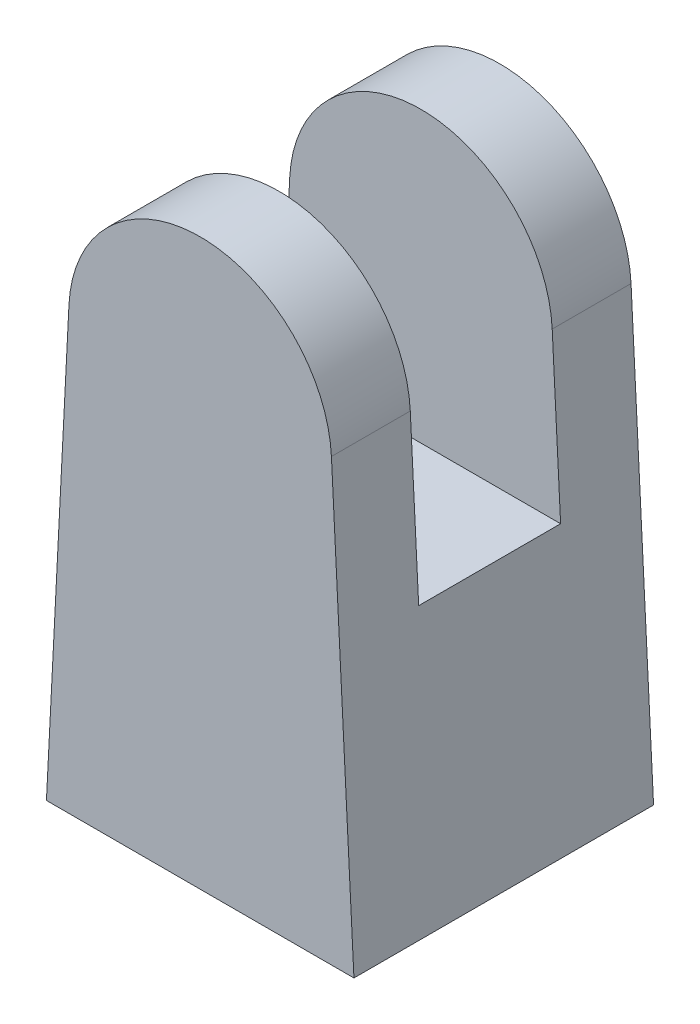
ISO-10303-21;
HEADER;
FILE_DESCRIPTION(('STEP AP214'),'2;1');
FILE_NAME('part.step','',(''),(''),'','','');
FILE_SCHEMA(('AUTOMOTIVE_DESIGN { 1 0 10303 214 1 1 1 1 }'));
ENDSEC;
DATA;
#1=APPLICATION_CONTEXT('core data for automotive mechanical design processes');
#2=APPLICATION_PROTOCOL_DEFINITION('international standard','automotive_design',2000,#1);
#3=PRODUCT_CONTEXT('',#1,'mechanical');
#4=PRODUCT('Part','Part','',(#3));
#5=PRODUCT_RELATED_PRODUCT_CATEGORY('part','',(#4));
#6=PRODUCT_DEFINITION_FORMATION('','',#4);
#7=PRODUCT_DEFINITION_CONTEXT('part definition',#1,'design');
#8=PRODUCT_DEFINITION('design','',#6,#7);
#9=PRODUCT_DEFINITION_SHAPE('','',#8);
#10=(LENGTH_UNIT() NAMED_UNIT(*) SI_UNIT(.MILLI.,.METRE.));
#11=(NAMED_UNIT(*) PLANE_ANGLE_UNIT() SI_UNIT($,.RADIAN.));
#12=(NAMED_UNIT(*) SI_UNIT($,.STERADIAN.) SOLID_ANGLE_UNIT());
#13=UNCERTAINTY_MEASURE_WITH_UNIT(LENGTH_MEASURE(1.E-05),#10,'distance_accuracy_value','');
#14=(GEOMETRIC_REPRESENTATION_CONTEXT(3) GLOBAL_UNCERTAINTY_ASSIGNED_CONTEXT((#13)) GLOBAL_UNIT_ASSIGNED_CONTEXT((#10,
#11,#12)) REPRESENTATION_CONTEXT('',''));
#15=CARTESIAN_POINT('',(0.,0.,0.));
#16=DIRECTION('',(0.,0.,1.));
#17=DIRECTION('',(1.,0.,0.));
#18=AXIS2_PLACEMENT_3D('',#15,#16,#17);
#19=CARTESIAN_POINT('',(0.,0.,57.));
#20=DIRECTION('',(0.,0.,-1.));
#21=DIRECTION('',(0.,-1.,0.));
#22=AXIS2_PLACEMENT_3D('',#19,#20,#21);
#23=CYLINDRICAL_SURFACE('',#22,50.);
#24=DIRECTION('',(0.,0.,-1.));
#25=VECTOR('',#24,1.);
#26=CARTESIAN_POINT('',(49.9347977557179,2.55264041642135,57.));
#27=LINE('',#26,#25);
#28=CARTESIAN_POINT('',(49.9347977557179,2.55264041642135,57.));
#29=VERTEX_POINT('',#28);
#30=CARTESIAN_POINT('',(49.9347977557179,2.55264041642135,27.));
#31=VERTEX_POINT('',#30);
#32=EDGE_CURVE('E163',#29,#31,#27,.T.);
#33=ORIENTED_EDGE('',*,*,#32,.T.);
#34=CARTESIAN_POINT('',(0.,0.,27.));
#35=DIRECTION('',(0.,0.,1.));
#36=DIRECTION('',(0.,1.,0.));
#37=AXIS2_PLACEMENT_3D('',#34,#35,#36);
#38=CIRCLE('',#37,50.);
#39=CARTESIAN_POINT('',(-49.9347977557179,2.55264041642102,27.));
#40=VERTEX_POINT('',#39);
#41=EDGE_CURVE('E132',#31,#40,#38,.T.);
#42=ORIENTED_EDGE('',*,*,#41,.T.);
#43=DIRECTION('',(0.,0.,-1.));
#44=VECTOR('',#43,1.);
#45=CARTESIAN_POINT('',(-49.9347977557179,2.55264041642103,57.));
#46=LINE('',#45,#44);
#47=CARTESIAN_POINT('',(-49.9347977557179,2.55264041642103,57.));
#48=VERTEX_POINT('',#47);
#49=EDGE_CURVE('E191',#48,#40,#46,.T.);
#50=ORIENTED_EDGE('',*,*,#49,.F.);
#51=CARTESIAN_POINT('',(0.,0.,57.));
#52=DIRECTION('',(0.,0.,1.));
#53=DIRECTION('',(0.,1.,0.));
#54=AXIS2_PLACEMENT_3D('',#51,#52,#53);
#55=CIRCLE('',#54,50.);
#56=EDGE_CURVE('E98',#29,#48,#55,.T.);
#57=ORIENTED_EDGE('',*,*,#56,.F.);
#58=EDGE_LOOP('',(#33,#42,#50,#57));
#59=FACE_BOUND('',#58,.T.);
#60=ADVANCED_FACE('F44',(#59),#23,.T.);
#61=CARTESIAN_POINT('',(58.5000000000006,-165.,57.));
#62=DIRECTION('',(-0.998695955114358,-0.0510528083284279,0.));
#63=DIRECTION('',(0.0510528083284279,-0.998695955114358,0.));
#64=AXIS2_PLACEMENT_3D('',#61,#62,#63);
#65=PLANE('',#64);
#66=DIRECTION('',(0.,0.,1.));
#67=VECTOR('',#66,1.);
#68=CARTESIAN_POINT('',(53.1324556067011,-59.9999999999998,57.));
#69=LINE('',#68,#67);
#70=CARTESIAN_POINT('',(53.1324556067011,-59.9999999999998,-27.));
#71=VERTEX_POINT('',#70);
#72=CARTESIAN_POINT('',(53.1324556067011,-59.9999999999998,27.));
#73=VERTEX_POINT('',#72);
#74=EDGE_CURVE('E121',#71,#73,#69,.T.);
#75=ORIENTED_EDGE('',*,*,#74,.T.);
#76=DIRECTION('',(-0.0510528083284279,0.998695955114358,0.));
#77=VECTOR('',#76,1.);
#78=CARTESIAN_POINT('',(58.5000000000006,-165.,27.));
#79=LINE('',#78,#77);
#80=EDGE_CURVE('E151',#73,#31,#79,.T.);
#81=ORIENTED_EDGE('',*,*,#80,.T.);
#82=ORIENTED_EDGE('',*,*,#32,.F.);
#83=DIRECTION('',(-0.0510528083284279,0.998695955114358,0.));
#84=VECTOR('',#83,1.);
#85=CARTESIAN_POINT('',(58.5000000000006,-165.,57.));
#86=LINE('',#85,#84);
#87=CARTESIAN_POINT('',(58.5000000000006,-165.,57.));
#88=VERTEX_POINT('',#87);
#89=EDGE_CURVE('E164',#88,#29,#86,.T.);
#90=ORIENTED_EDGE('',*,*,#89,.F.);
#91=DIRECTION('',(0.,0.,-1.));
#92=VECTOR('',#91,1.);
#93=CARTESIAN_POINT('',(58.5000000000006,-165.,57.));
#94=LINE('',#93,#92);
#95=CARTESIAN_POINT('',(58.5000000000006,-165.,-57.));
#96=VERTEX_POINT('',#95);
#97=EDGE_CURVE('E173',#88,#96,#94,.T.);
#98=ORIENTED_EDGE('',*,*,#97,.T.);
#99=DIRECTION('',(-0.0510528083284279,0.998695955114358,0.));
#100=VECTOR('',#99,1.);
#101=CARTESIAN_POINT('',(58.5000000000006,-165.,-57.));
#102=LINE('',#101,#100);
#103=CARTESIAN_POINT('',(49.9347977557179,2.55264041642135,-57.));
#104=VERTEX_POINT('',#103);
#105=EDGE_CURVE('E158',#96,#104,#102,.T.);
#106=ORIENTED_EDGE('',*,*,#105,.T.);
#107=CARTESIAN_POINT('',(49.9347977557179,2.55264041642135,-27.));
#108=VERTEX_POINT('',#107);
#109=EDGE_CURVE('E141',#108,#104,#27,.T.);
#110=ORIENTED_EDGE('',*,*,#109,.F.);
#111=DIRECTION('',(0.0510528083284279,-0.998695955114358,0.));
#112=VECTOR('',#111,1.);
#113=CARTESIAN_POINT('',(58.5000000000006,-165.,-27.));
#114=LINE('',#113,#112);
#115=EDGE_CURVE('E133',#108,#71,#114,.T.);
#116=ORIENTED_EDGE('',*,*,#115,.T.);
#117=EDGE_LOOP('',(#75,#81,#82,#90,#98,#106,#110,#116));
#118=FACE_BOUND('',#117,.T.);
#119=ADVANCED_FACE('F46',(#118),#65,.F.);
#120=CARTESIAN_POINT('',(-49.9347977557179,2.55264041642103,-27.));
#121=VERTEX_POINT('',#120);
#122=CARTESIAN_POINT('',(-49.9347977557179,2.55264041642103,-57.));
#123=VERTEX_POINT('',#122);
#124=EDGE_CURVE('E190',#121,#123,#46,.T.);
#125=ORIENTED_EDGE('',*,*,#124,.F.);
#126=CARTESIAN_POINT('',(0.,0.,-27.));
#127=DIRECTION('',(0.,0.,-1.));
#128=DIRECTION('',(0.,-1.,0.));
#129=AXIS2_PLACEMENT_3D('',#126,#127,#128);
#130=CIRCLE('',#129,50.);
#131=EDGE_CURVE('E60',#121,#108,#130,.T.);
#132=ORIENTED_EDGE('',*,*,#131,.T.);
#133=ORIENTED_EDGE('',*,*,#109,.T.);
#134=CARTESIAN_POINT('',(0.,0.,-57.));
#135=DIRECTION('',(0.,0.,1.));
#136=DIRECTION('',(0.,1.,0.));
#137=AXIS2_PLACEMENT_3D('',#134,#135,#136);
#138=CIRCLE('',#137,50.);
#139=EDGE_CURVE('E176',#104,#123,#138,.T.);
#140=ORIENTED_EDGE('',*,*,#139,.T.);
#141=EDGE_LOOP('',(#125,#132,#133,#140));
#142=FACE_BOUND('',#141,.T.);
#143=ADVANCED_FACE('F217',(#142),#23,.T.);
#144=CARTESIAN_POINT('',(-58.4999999999994,-165.,57.));
#145=DIRECTION('',(0.998695955114359,-0.0510528083284206,0.));
#146=DIRECTION('',(0.0510528083284206,0.998695955114359,0.));
#147=AXIS2_PLACEMENT_3D('',#144,#145,#146);
#148=PLANE('',#147);
#149=ORIENTED_EDGE('',*,*,#49,.T.);
#150=DIRECTION('',(-0.0510528083284206,-0.998695955114359,0.));
#151=VECTOR('',#150,1.);
#152=CARTESIAN_POINT('',(-58.4999999999994,-165.,27.));
#153=LINE('',#152,#151);
#154=CARTESIAN_POINT('',(-53.1324556067007,-60.0000000000002,27.));
#155=VERTEX_POINT('',#154);
#156=EDGE_CURVE('E11',#40,#155,#153,.T.);
#157=ORIENTED_EDGE('',*,*,#156,.T.);
#158=DIRECTION('',(0.,0.,-1.));
#159=VECTOR('',#158,1.);
#160=CARTESIAN_POINT('',(-53.1324556067007,-60.0000000000002,57.));
#161=LINE('',#160,#159);
#162=CARTESIAN_POINT('',(-53.1324556067007,-60.0000000000002,-27.));
#163=VERTEX_POINT('',#162);
#164=EDGE_CURVE('E53',#155,#163,#161,.T.);
#165=ORIENTED_EDGE('',*,*,#164,.T.);
#166=DIRECTION('',(0.0510528083284206,0.998695955114359,0.));
#167=VECTOR('',#166,1.);
#168=CARTESIAN_POINT('',(-58.4999999999994,-165.,-27.));
#169=LINE('',#168,#167);
#170=EDGE_CURVE('E136',#163,#121,#169,.T.);
#171=ORIENTED_EDGE('',*,*,#170,.T.);
#172=ORIENTED_EDGE('',*,*,#124,.T.);
#173=DIRECTION('',(-0.0510528083284206,-0.998695955114359,0.));
#174=VECTOR('',#173,1.);
#175=CARTESIAN_POINT('',(-58.4999999999994,-165.,-57.));
#176=LINE('',#175,#174);
#177=CARTESIAN_POINT('',(-58.4999999999994,-165.,-57.));
#178=VERTEX_POINT('',#177);
#179=EDGE_CURVE('E180',#123,#178,#176,.T.);
#180=ORIENTED_EDGE('',*,*,#179,.T.);
#181=DIRECTION('',(0.,0.,-1.));
#182=VECTOR('',#181,1.);
#183=CARTESIAN_POINT('',(-58.4999999999994,-165.,57.));
#184=LINE('',#183,#182);
#185=CARTESIAN_POINT('',(-58.4999999999994,-165.,57.));
#186=VERTEX_POINT('',#185);
#187=EDGE_CURVE('E187',#186,#178,#184,.T.);
#188=ORIENTED_EDGE('',*,*,#187,.F.);
#189=DIRECTION('',(-0.0510528083284206,-0.998695955114359,0.));
#190=VECTOR('',#189,1.);
#191=CARTESIAN_POINT('',(-58.4999999999994,-165.,57.));
#192=LINE('',#191,#190);
#193=EDGE_CURVE('E168',#48,#186,#192,.T.);
#194=ORIENTED_EDGE('',*,*,#193,.F.);
#195=EDGE_LOOP('',(#149,#157,#165,#171,#172,#180,#188,#194));
#196=FACE_BOUND('',#195,.T.);
#197=ADVANCED_FACE('F201',(#196),#148,.F.);
#198=CARTESIAN_POINT('',(58.5000000000006,-165.,57.));
#199=DIRECTION('',(0.,1.,0.));
#200=DIRECTION('',(0.,0.,-1.));
#201=AXIS2_PLACEMENT_3D('',#198,#199,#200);
#202=PLANE('',#201);
#203=CARTESIAN_POINT('',(5.76094420909117E-13,-165.,0.));
#204=DIRECTION('',(0.,-1.,0.));
#205=DIRECTION('',(0.,0.,1.));
#206=AXIS2_PLACEMENT_3D('',#203,#204,#205);
#207=CIRCLE('',#206,37.5);
#208=CARTESIAN_POINT('',(5.76094420909117E-13,-165.,37.5));
#209=VERTEX_POINT('',#208);
#210=EDGE_CURVE('E159',#209,#209,#207,.T.);
#211=ORIENTED_EDGE('',*,*,#210,.F.);
#212=EDGE_LOOP('',(#211));
#213=FACE_BOUND('',#212,.T.);
#214=DIRECTION('',(1.,0.,0.));
#215=VECTOR('',#214,1.);
#216=CARTESIAN_POINT('',(58.5000000000006,-165.,-57.));
#217=LINE('',#216,#215);
#218=EDGE_CURVE('E90',#178,#96,#217,.T.);
#219=ORIENTED_EDGE('',*,*,#218,.T.);
#220=ORIENTED_EDGE('',*,*,#97,.F.);
#221=DIRECTION('',(1.,0.,0.));
#222=VECTOR('',#221,1.);
#223=CARTESIAN_POINT('',(58.5000000000006,-165.,57.));
#224=LINE('',#223,#222);
#225=EDGE_CURVE('E69',#186,#88,#224,.T.);
#226=ORIENTED_EDGE('',*,*,#225,.F.);
#227=ORIENTED_EDGE('',*,*,#187,.T.);
#228=EDGE_LOOP('',(#219,#220,#226,#227));
#229=FACE_BOUND('',#228,.T.);
#230=ADVANCED_FACE('F220',(#213,#229),#202,.F.);
#231=CARTESIAN_POINT('',(0.,0.,57.));
#232=DIRECTION('',(0.,0.,1.));
#233=DIRECTION('',(0.,1.,0.));
#234=AXIS2_PLACEMENT_3D('',#231,#232,#233);
#235=PLANE('',#234);
#236=ORIENTED_EDGE('',*,*,#89,.T.);
#237=ORIENTED_EDGE('',*,*,#56,.T.);
#238=ORIENTED_EDGE('',*,*,#193,.T.);
#239=ORIENTED_EDGE('',*,*,#225,.T.);
#240=EDGE_LOOP('',(#236,#237,#238,#239));
#241=FACE_BOUND('',#240,.T.);
#242=ADVANCED_FACE('F210',(#241),#235,.T.);
#243=CARTESIAN_POINT('',(0.,0.,-57.));
#244=DIRECTION('',(0.,0.,1.));
#245=DIRECTION('',(0.,1.,0.));
#246=AXIS2_PLACEMENT_3D('',#243,#244,#245);
#247=PLANE('',#246);
#248=ORIENTED_EDGE('',*,*,#105,.F.);
#249=ORIENTED_EDGE('',*,*,#218,.F.);
#250=ORIENTED_EDGE('',*,*,#179,.F.);
#251=ORIENTED_EDGE('',*,*,#139,.F.);
#252=EDGE_LOOP('',(#248,#249,#250,#251));
#253=FACE_BOUND('',#252,.T.);
#254=ADVANCED_FACE('F214',(#253),#247,.F.);
#255=CARTESIAN_POINT('',(5.83077383586803E-13,-167.,0.));
#256=DIRECTION('',(0.,1.,0.));
#257=DIRECTION('',(0.,0.,-1.));
#258=AXIS2_PLACEMENT_3D('',#255,#256,#257);
#259=CYLINDRICAL_SURFACE('',#258,37.5);
#260=CARTESIAN_POINT('',(5.83077383586803E-13,-167.,0.));
#261=DIRECTION('',(0.,-1.,0.));
#262=DIRECTION('',(0.,0.,1.));
#263=AXIS2_PLACEMENT_3D('',#260,#261,#262);
#264=CIRCLE('',#263,37.5);
#265=CARTESIAN_POINT('',(5.83077383586803E-13,-167.,37.5));
#266=VERTEX_POINT('',#265);
#267=EDGE_CURVE('E154',#266,#266,#264,.T.);
#268=ORIENTED_EDGE('',*,*,#267,.F.);
#269=EDGE_LOOP('',(#268));
#270=FACE_BOUND('',#269,.T.);
#271=ORIENTED_EDGE('',*,*,#210,.T.);
#272=EDGE_LOOP('',(#271));
#273=FACE_BOUND('',#272,.T.);
#274=ADVANCED_FACE('F259',(#270,#273),#259,.T.);
#275=CARTESIAN_POINT('',(5.83077383586803E-13,-167.,0.));
#276=DIRECTION('',(0.,-1.,0.));
#277=DIRECTION('',(0.,0.,1.));
#278=AXIS2_PLACEMENT_3D('',#275,#276,#277);
#279=PLANE('',#278);
#280=ORIENTED_EDGE('',*,*,#267,.T.);
#281=EDGE_LOOP('',(#280));
#282=FACE_BOUND('',#281,.T.);
#283=ADVANCED_FACE('F266',(#282),#279,.T.);
#284=CARTESIAN_POINT('',(58.4999999999999,53.9781896744281,27.));
#285=DIRECTION('',(0.,0.,1.));
#286=DIRECTION('',(0.,1.,0.));
#287=AXIS2_PLACEMENT_3D('',#284,#285,#286);
#288=PLANE('',#287);
#289=DIRECTION('',(-1.,0.,0.));
#290=VECTOR('',#289,1.);
#291=CARTESIAN_POINT('',(58.5000000000002,-59.9999999999998,27.));
#292=LINE('',#291,#290);
#293=EDGE_CURVE('E127',#73,#155,#292,.T.);
#294=ORIENTED_EDGE('',*,*,#293,.T.);
#295=ORIENTED_EDGE('',*,*,#156,.F.);
#296=ORIENTED_EDGE('',*,*,#41,.F.);
#297=ORIENTED_EDGE('',*,*,#80,.F.);
#298=EDGE_LOOP('',(#294,#295,#296,#297));
#299=FACE_BOUND('',#298,.T.);
#300=ADVANCED_FACE('F204',(#299),#288,.F.);
#301=CARTESIAN_POINT('',(58.5000000000002,-59.9999999999998,-27.));
#302=DIRECTION('',(0.,-1.,0.));
#303=DIRECTION('',(0.,0.,1.));
#304=AXIS2_PLACEMENT_3D('',#301,#302,#303);
#305=PLANE('',#304);
#306=DIRECTION('',(-1.,0.,0.));
#307=VECTOR('',#306,1.);
#308=CARTESIAN_POINT('',(58.5000000000002,-59.9999999999998,-27.));
#309=LINE('',#308,#307);
#310=EDGE_CURVE('E124',#71,#163,#309,.T.);
#311=ORIENTED_EDGE('',*,*,#310,.T.);
#312=ORIENTED_EDGE('',*,*,#164,.F.);
#313=ORIENTED_EDGE('',*,*,#293,.F.);
#314=ORIENTED_EDGE('',*,*,#74,.F.);
#315=EDGE_LOOP('',(#311,#312,#313,#314));
#316=FACE_BOUND('',#315,.T.);
#317=ADVANCED_FACE('F123',(#316),#305,.F.);
#318=CARTESIAN_POINT('',(58.4999999999999,53.9781896744281,-27.));
#319=DIRECTION('',(0.,0.,-1.));
#320=DIRECTION('',(0.,-1.,0.));
#321=AXIS2_PLACEMENT_3D('',#318,#319,#320);
#322=PLANE('',#321);
#323=ORIENTED_EDGE('',*,*,#131,.F.);
#324=ORIENTED_EDGE('',*,*,#170,.F.);
#325=ORIENTED_EDGE('',*,*,#310,.F.);
#326=ORIENTED_EDGE('',*,*,#115,.F.);
#327=EDGE_LOOP('',(#323,#324,#325,#326));
#328=FACE_BOUND('',#327,.T.);
#329=ADVANCED_FACE('F135',(#328),#322,.F.);
#330=CLOSED_SHELL('',(#60,#119,#143,#197,#230,#242,#254,#274,#283,#300,#317,#329));
#331=MANIFOLD_SOLID_BREP('B2',#330);
#332=ADVANCED_BREP_SHAPE_REPRESENTATION('',(#18,#331),#14);
#333=SHAPE_DEFINITION_REPRESENTATION(#9,#332);
ENDSEC;
END-ISO-10303-21;
